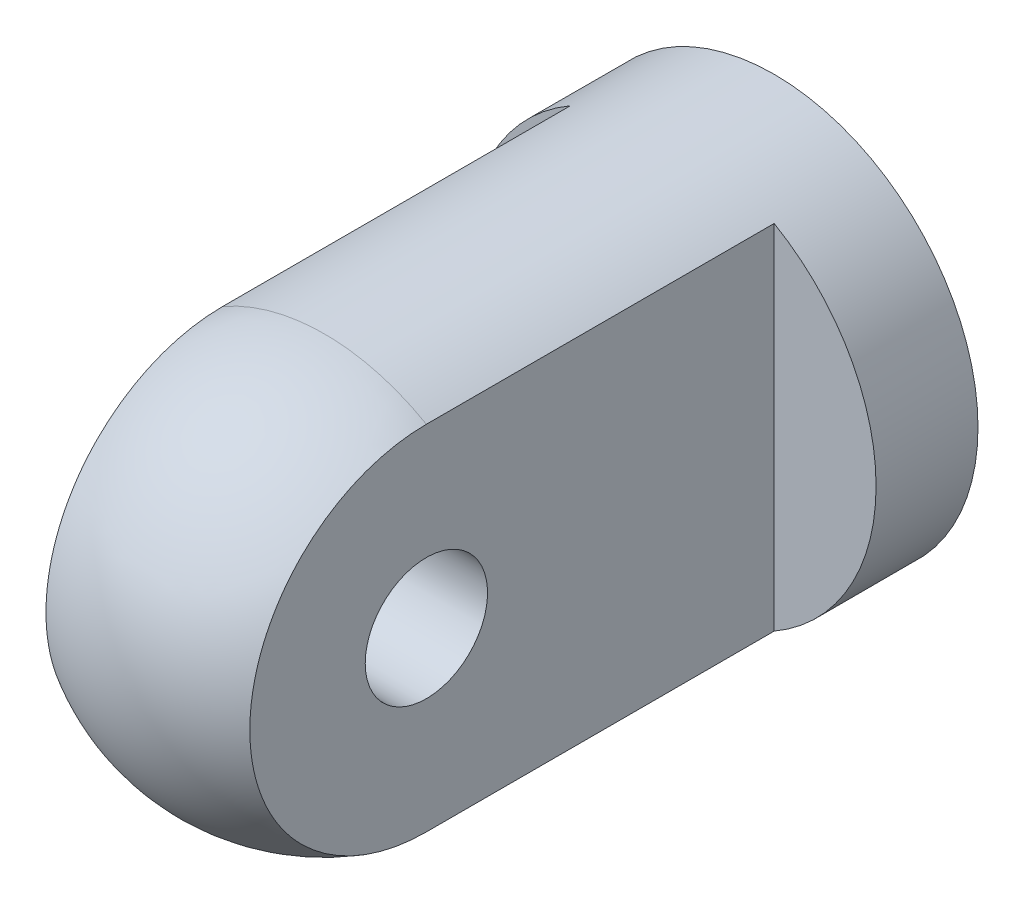
ISO-10303-21;
HEADER;
FILE_DESCRIPTION(('STEP AP214'),'2;1');
FILE_NAME('part.step','',(''),(''),'','','');
FILE_SCHEMA(('AUTOMOTIVE_DESIGN { 1 0 10303 214 1 1 1 1 }'));
ENDSEC;
DATA;
#1=APPLICATION_CONTEXT('core data for automotive mechanical design processes');
#2=APPLICATION_PROTOCOL_DEFINITION('international standard','automotive_design',2000,#1);
#3=PRODUCT_CONTEXT('',#1,'mechanical');
#4=PRODUCT('Part','Part','',(#3));
#5=PRODUCT_RELATED_PRODUCT_CATEGORY('part','',(#4));
#6=PRODUCT_DEFINITION_FORMATION('','',#4);
#7=PRODUCT_DEFINITION_CONTEXT('part definition',#1,'design');
#8=PRODUCT_DEFINITION('design','',#6,#7);
#9=PRODUCT_DEFINITION_SHAPE('','',#8);
#10=(LENGTH_UNIT() NAMED_UNIT(*) SI_UNIT(.MILLI.,.METRE.));
#11=(NAMED_UNIT(*) PLANE_ANGLE_UNIT() SI_UNIT($,.RADIAN.));
#12=(NAMED_UNIT(*) SI_UNIT($,.STERADIAN.) SOLID_ANGLE_UNIT());
#13=UNCERTAINTY_MEASURE_WITH_UNIT(LENGTH_MEASURE(1.E-05),#10,'distance_accuracy_value','');
#14=(GEOMETRIC_REPRESENTATION_CONTEXT(3) GLOBAL_UNCERTAINTY_ASSIGNED_CONTEXT((#13)) GLOBAL_UNIT_ASSIGNED_CONTEXT((#10,
#11,#12)) REPRESENTATION_CONTEXT('',''));
#15=CARTESIAN_POINT('',(0.,0.,0.));
#16=DIRECTION('',(0.,0.,1.));
#17=DIRECTION('',(1.,0.,0.));
#18=AXIS2_PLACEMENT_3D('',#15,#16,#17);
#19=CARTESIAN_POINT('',(0.,0.,20.3587312210161));
#20=DIRECTION('',(0.,0.,1.));
#21=DIRECTION('',(1.,0.,0.));
#22=AXIS2_PLACEMENT_3D('',#19,#20,#21);
#23=CYLINDRICAL_SURFACE('',#22,12.7);
#24=CARTESIAN_POINT('',(0.,0.,0.));
#25=DIRECTION('',(0.,0.,1.));
#26=DIRECTION('',(1.,0.,0.));
#27=AXIS2_PLACEMENT_3D('',#24,#25,#26);
#28=CIRCLE('',#27,12.7);
#29=CARTESIAN_POINT('',(12.7,0.,0.));
#30=VERTEX_POINT('',#29);
#31=EDGE_CURVE('E86',#30,#30,#28,.T.);
#32=ORIENTED_EDGE('',*,*,#31,.T.);
#33=EDGE_LOOP('',(#32));
#34=FACE_BOUND('',#33,.T.);
#35=CARTESIAN_POINT('',(0.,0.,6.35));
#36=DIRECTION('',(0.,0.,-1.));
#37=DIRECTION('',(-1.,0.,0.));
#38=AXIS2_PLACEMENT_3D('',#35,#36,#37);
#39=CIRCLE('',#38,12.7);
#40=CARTESIAN_POINT('',(6.35,10.9985226280624,6.35));
#41=VERTEX_POINT('',#40);
#42=CARTESIAN_POINT('',(6.35,-10.9985226280624,6.35));
#43=VERTEX_POINT('',#42);
#44=EDGE_CURVE('E11',#41,#43,#39,.T.);
#45=ORIENTED_EDGE('',*,*,#44,.T.);
#46=DIRECTION('',(0.,0.,1.));
#47=VECTOR('',#46,1.);
#48=CARTESIAN_POINT('',(6.35,-10.9985226280624,20.3587312210161));
#49=LINE('',#48,#47);
#50=CARTESIAN_POINT('',(6.35,-10.9985226280624,28.0174624420323));
#51=VERTEX_POINT('',#50);
#52=EDGE_CURVE('E94',#43,#51,#49,.T.);
#53=ORIENTED_EDGE('',*,*,#52,.T.);
#54=CARTESIAN_POINT('',(0.,0.,28.0174624420323));
#55=DIRECTION('',(0.,0.,1.));
#56=DIRECTION('',(1.,0.,0.));
#57=AXIS2_PLACEMENT_3D('',#54,#55,#56);
#58=CIRCLE('',#57,12.7);
#59=CARTESIAN_POINT('',(-6.35,-10.9985226280624,28.0174624420323));
#60=VERTEX_POINT('',#59);
#61=EDGE_CURVE('E93',#60,#51,#58,.T.);
#62=ORIENTED_EDGE('',*,*,#61,.F.);
#63=DIRECTION('',(0.,0.,1.));
#64=VECTOR('',#63,1.);
#65=CARTESIAN_POINT('',(-6.35,-10.9985226280624,20.3587312210161));
#66=LINE('',#65,#64);
#67=CARTESIAN_POINT('',(-6.35,-10.9985226280623,6.35));
#68=VERTEX_POINT('',#67);
#69=EDGE_CURVE('E33',#68,#60,#66,.T.);
#70=ORIENTED_EDGE('',*,*,#69,.F.);
#71=CARTESIAN_POINT('',(0.,0.,6.35));
#72=DIRECTION('',(0.,0.,1.));
#73=DIRECTION('',(1.,0.,0.));
#74=AXIS2_PLACEMENT_3D('',#71,#72,#73);
#75=CIRCLE('',#74,12.7);
#76=CARTESIAN_POINT('',(-6.35,10.9985226280624,6.35));
#77=VERTEX_POINT('',#76);
#78=EDGE_CURVE('E26',#77,#68,#75,.T.);
#79=ORIENTED_EDGE('',*,*,#78,.F.);
#80=DIRECTION('',(0.,0.,1.));
#81=VECTOR('',#80,1.);
#82=CARTESIAN_POINT('',(-6.35,10.9985226280624,20.3587312210161));
#83=LINE('',#82,#81);
#84=CARTESIAN_POINT('',(-6.35,10.9985226280624,28.0174624420323));
#85=VERTEX_POINT('',#84);
#86=EDGE_CURVE('E59',#85,#77,#83,.F.);
#87=ORIENTED_EDGE('',*,*,#86,.F.);
#88=CARTESIAN_POINT('',(6.35,10.9985226280624,28.0174624420323));
#89=VERTEX_POINT('',#88);
#90=EDGE_CURVE('E90',#89,#85,#58,.T.);
#91=ORIENTED_EDGE('',*,*,#90,.F.);
#92=DIRECTION('',(0.,0.,1.));
#93=VECTOR('',#92,1.);
#94=CARTESIAN_POINT('',(6.35,10.9985226280624,20.3587312210161));
#95=LINE('',#94,#93);
#96=EDGE_CURVE('E41',#89,#41,#95,.F.);
#97=ORIENTED_EDGE('',*,*,#96,.T.);
#98=EDGE_LOOP('',(#45,#53,#62,#70,#79,#87,#91,#97));
#99=FACE_BOUND('',#98,.T.);
#100=ADVANCED_FACE('F16',(#34,#99),#23,.T.);
#101=CARTESIAN_POINT('',(0.,0.,28.0174624420323));
#102=DIRECTION('',(0.,0.,1.));
#103=DIRECTION('',(1.,0.,0.));
#104=AXIS2_PLACEMENT_3D('',#101,#102,#103);
#105=SPHERICAL_SURFACE('',#104,12.7);
#106=ORIENTED_EDGE('',*,*,#61,.T.);
#107=CARTESIAN_POINT('',(6.35,0.,28.0174624420323));
#108=DIRECTION('',(-1.,0.,0.));
#109=DIRECTION('',(0.,0.,1.));
#110=AXIS2_PLACEMENT_3D('',#107,#108,#109);
#111=CIRCLE('',#110,10.9985226280624);
#112=EDGE_CURVE('E78',#51,#89,#111,.T.);
#113=ORIENTED_EDGE('',*,*,#112,.T.);
#114=ORIENTED_EDGE('',*,*,#90,.T.);
#115=CARTESIAN_POINT('',(-6.35,0.,28.0174624420323));
#116=DIRECTION('',(-1.,0.,0.));
#117=DIRECTION('',(0.,0.,1.));
#118=AXIS2_PLACEMENT_3D('',#115,#116,#117);
#119=CIRCLE('',#118,10.9985226280624);
#120=EDGE_CURVE('E63',#60,#85,#119,.T.);
#121=ORIENTED_EDGE('',*,*,#120,.F.);
#122=EDGE_LOOP('',(#106,#113,#114,#121));
#123=FACE_BOUND('',#122,.T.);
#124=ADVANCED_FACE('F126',(#123),#105,.T.);
#125=CARTESIAN_POINT('',(6.35,0.,0.));
#126=DIRECTION('',(0.,0.,1.));
#127=DIRECTION('',(1.,0.,0.));
#128=AXIS2_PLACEMENT_3D('',#125,#126,#127);
#129=PLANE('',#128);
#130=ORIENTED_EDGE('',*,*,#31,.F.);
#131=EDGE_LOOP('',(#130));
#132=FACE_BOUND('',#131,.T.);
#133=ADVANCED_FACE('F18',(#132),#129,.F.);
#134=CARTESIAN_POINT('',(-31.75,25.4,6.35));
#135=DIRECTION('',(0.,0.,1.));
#136=DIRECTION('',(1.,0.,0.));
#137=AXIS2_PLACEMENT_3D('',#134,#135,#136);
#138=PLANE('',#137);
#139=ORIENTED_EDGE('',*,*,#78,.T.);
#140=DIRECTION('',(0.,-1.,0.));
#141=VECTOR('',#140,1.);
#142=CARTESIAN_POINT('',(-6.35,25.4,6.35));
#143=LINE('',#142,#141);
#144=EDGE_CURVE('E62',#77,#68,#143,.T.);
#145=ORIENTED_EDGE('',*,*,#144,.F.);
#146=EDGE_LOOP('',(#139,#145));
#147=FACE_BOUND('',#146,.T.);
#148=ADVANCED_FACE('F72',(#147),#138,.T.);
#149=CARTESIAN_POINT('',(-6.35,25.4,34.5003233587539));
#150=DIRECTION('',(-1.,0.,0.));
#151=DIRECTION('',(0.,0.,1.));
#152=AXIS2_PLACEMENT_3D('',#149,#150,#151);
#153=PLANE('',#152);
#154=CARTESIAN_POINT('',(-6.35,0.,28.0174624420323));
#155=DIRECTION('',(-1.,0.,0.));
#156=DIRECTION('',(0.,0.,1.));
#157=AXIS2_PLACEMENT_3D('',#154,#155,#156);
#158=CIRCLE('',#157,3.81);
#159=CARTESIAN_POINT('',(-6.35,0.,31.8274624420323));
#160=VERTEX_POINT('',#159);
#161=EDGE_CURVE('E74',#160,#160,#158,.T.);
#162=ORIENTED_EDGE('',*,*,#161,.F.);
#163=EDGE_LOOP('',(#162));
#164=FACE_BOUND('',#163,.T.);
#165=ORIENTED_EDGE('',*,*,#69,.T.);
#166=ORIENTED_EDGE('',*,*,#120,.T.);
#167=ORIENTED_EDGE('',*,*,#86,.T.);
#168=ORIENTED_EDGE('',*,*,#144,.T.);
#169=EDGE_LOOP('',(#165,#166,#167,#168));
#170=FACE_BOUND('',#169,.T.);
#171=ADVANCED_FACE('F61',(#164,#170),#153,.T.);
#172=CARTESIAN_POINT('',(31.75,25.4,6.35));
#173=DIRECTION('',(0.,0.,-1.));
#174=DIRECTION('',(-1.,0.,0.));
#175=AXIS2_PLACEMENT_3D('',#172,#173,#174);
#176=PLANE('',#175);
#177=DIRECTION('',(0.,-1.,0.));
#178=VECTOR('',#177,1.);
#179=CARTESIAN_POINT('',(6.35,25.4,6.35));
#180=LINE('',#179,#178);
#181=EDGE_CURVE('E69',#41,#43,#180,.T.);
#182=ORIENTED_EDGE('',*,*,#181,.T.);
#183=ORIENTED_EDGE('',*,*,#44,.F.);
#184=EDGE_LOOP('',(#182,#183));
#185=FACE_BOUND('',#184,.T.);
#186=ADVANCED_FACE('F122',(#185),#176,.F.);
#187=CARTESIAN_POINT('',(6.35,25.4,34.5003233587539));
#188=DIRECTION('',(-1.,0.,0.));
#189=DIRECTION('',(0.,0.,1.));
#190=AXIS2_PLACEMENT_3D('',#187,#188,#189);
#191=PLANE('',#190);
#192=CARTESIAN_POINT('',(6.35,0.,28.0174624420323));
#193=DIRECTION('',(-1.,0.,0.));
#194=DIRECTION('',(0.,0.,1.));
#195=AXIS2_PLACEMENT_3D('',#192,#193,#194);
#196=CIRCLE('',#195,3.81);
#197=CARTESIAN_POINT('',(6.35,0.,31.8274624420323));
#198=VERTEX_POINT('',#197);
#199=EDGE_CURVE('E20',#198,#198,#196,.T.);
#200=ORIENTED_EDGE('',*,*,#199,.T.);
#201=EDGE_LOOP('',(#200));
#202=FACE_BOUND('',#201,.T.);
#203=ORIENTED_EDGE('',*,*,#181,.F.);
#204=ORIENTED_EDGE('',*,*,#96,.F.);
#205=ORIENTED_EDGE('',*,*,#112,.F.);
#206=ORIENTED_EDGE('',*,*,#52,.F.);
#207=EDGE_LOOP('',(#203,#204,#205,#206));
#208=FACE_BOUND('',#207,.T.);
#209=ADVANCED_FACE('F113',(#202,#208),#191,.F.);
#210=CARTESIAN_POINT('',(-19.05,0.,28.0174624420323));
#211=DIRECTION('',(1.,0.,0.));
#212=DIRECTION('',(0.,0.,-1.));
#213=AXIS2_PLACEMENT_3D('',#210,#211,#212);
#214=CYLINDRICAL_SURFACE('',#213,3.81);
#215=ORIENTED_EDGE('',*,*,#161,.T.);
#216=EDGE_LOOP('',(#215));
#217=FACE_BOUND('',#216,.T.);
#218=ORIENTED_EDGE('',*,*,#199,.F.);
#219=EDGE_LOOP('',(#218));
#220=FACE_BOUND('',#219,.T.);
#221=ADVANCED_FACE('F115',(#217,#220),#214,.F.);
#222=CLOSED_SHELL('',(#100,#124,#133,#148,#171,#186,#209,#221));
#223=MANIFOLD_SOLID_BREP('B1',#222);
#224=ADVANCED_BREP_SHAPE_REPRESENTATION('',(#18,#223),#14);
#225=SHAPE_DEFINITION_REPRESENTATION(#9,#224);
ENDSEC;
END-ISO-10303-21;
